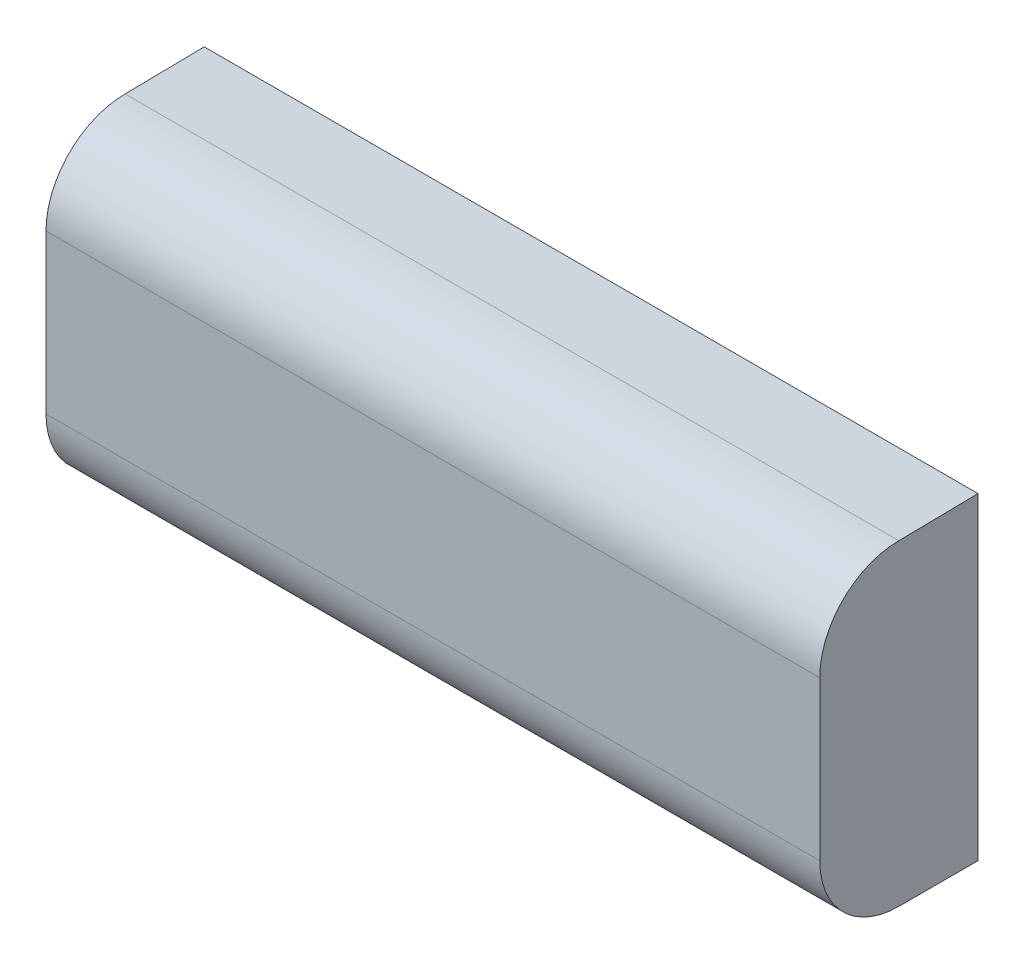
ISO-10303-21;
HEADER;
FILE_DESCRIPTION(('STEP AP214'),'2;1');
FILE_NAME('part.step','',(''),(''),'','','');
FILE_SCHEMA(('AUTOMOTIVE_DESIGN { 1 0 10303 214 1 1 1 1 }'));
ENDSEC;
DATA;
#1=APPLICATION_CONTEXT('core data for automotive mechanical design processes');
#2=APPLICATION_PROTOCOL_DEFINITION('international standard','automotive_design',2000,#1);
#3=PRODUCT_CONTEXT('',#1,'mechanical');
#4=PRODUCT('Part','Part','',(#3));
#5=PRODUCT_RELATED_PRODUCT_CATEGORY('part','',(#4));
#6=PRODUCT_DEFINITION_FORMATION('','',#4);
#7=PRODUCT_DEFINITION_CONTEXT('part definition',#1,'design');
#8=PRODUCT_DEFINITION('design','',#6,#7);
#9=PRODUCT_DEFINITION_SHAPE('','',#8);
#10=(LENGTH_UNIT() NAMED_UNIT(*) SI_UNIT(.MILLI.,.METRE.));
#11=(NAMED_UNIT(*) PLANE_ANGLE_UNIT() SI_UNIT($,.RADIAN.));
#12=(NAMED_UNIT(*) SI_UNIT($,.STERADIAN.) SOLID_ANGLE_UNIT());
#13=UNCERTAINTY_MEASURE_WITH_UNIT(LENGTH_MEASURE(1.E-05),#10,'distance_accuracy_value','');
#14=(GEOMETRIC_REPRESENTATION_CONTEXT(3) GLOBAL_UNCERTAINTY_ASSIGNED_CONTEXT((#13)) GLOBAL_UNIT_ASSIGNED_CONTEXT((#10,
#11,#12)) REPRESENTATION_CONTEXT('',''));
#15=CARTESIAN_POINT('',(0.,0.,0.));
#16=DIRECTION('',(0.,0.,1.));
#17=DIRECTION('',(1.,0.,0.));
#18=AXIS2_PLACEMENT_3D('',#15,#16,#17);
#19=CARTESIAN_POINT('',(372.58,83.2090743568865,-38.1));
#20=DIRECTION('',(0.,0.,1.));
#21=DIRECTION('',(1.,0.,0.));
#22=AXIS2_PLACEMENT_3D('',#19,#20,#21);
#23=PLANE('',#22);
#24=DIRECTION('',(0.,1.,0.));
#25=VECTOR('',#24,1.);
#26=CARTESIAN_POINT('',(0.,83.2090743568865,-38.1));
#27=LINE('',#26,#25);
#28=CARTESIAN_POINT('',(0.,-69.8859046390184,-38.1));
#29=VERTEX_POINT('',#28);
#30=CARTESIAN_POINT('',(0.,83.2090743568865,-38.1));
#31=VERTEX_POINT('',#30);
#32=EDGE_CURVE('E123',#29,#31,#27,.T.);
#33=ORIENTED_EDGE('',*,*,#32,.T.);
#34=DIRECTION('',(-1.,0.,0.));
#35=VECTOR('',#34,1.);
#36=CARTESIAN_POINT('',(372.58,83.2090743568865,-38.1));
#37=LINE('',#36,#35);
#38=CARTESIAN_POINT('',(372.58,83.2090743568865,-38.1));
#39=VERTEX_POINT('',#38);
#40=EDGE_CURVE('E11',#39,#31,#37,.T.);
#41=ORIENTED_EDGE('',*,*,#40,.F.);
#42=DIRECTION('',(0.,1.,0.));
#43=VECTOR('',#42,1.);
#44=CARTESIAN_POINT('',(372.58,83.2090743568865,-38.1));
#45=LINE('',#44,#43);
#46=CARTESIAN_POINT('',(372.58,-69.8859046390184,-38.1));
#47=VERTEX_POINT('',#46);
#48=EDGE_CURVE('E133',#47,#39,#45,.T.);
#49=ORIENTED_EDGE('',*,*,#48,.F.);
#50=DIRECTION('',(-1.,0.,0.));
#51=VECTOR('',#50,1.);
#52=CARTESIAN_POINT('',(372.58,-69.8859046390184,-38.1));
#53=LINE('',#52,#51);
#54=EDGE_CURVE('E119',#47,#29,#53,.T.);
#55=ORIENTED_EDGE('',*,*,#54,.T.);
#56=EDGE_LOOP('',(#33,#41,#49,#55));
#57=FACE_BOUND('',#56,.T.);
#58=ADVANCED_FACE('F39',(#57),#23,.F.);
#59=CARTESIAN_POINT('',(372.58,83.2090743568865,-38.1));
#60=DIRECTION('',(0.,-0.999878088718047,-0.0156143428150319));
#61=DIRECTION('',(0.,0.0156143428150319,-0.999878088718047));
#62=AXIS2_PLACEMENT_3D('',#59,#60,#61);
#63=PLANE('',#62);
#64=DIRECTION('',(0.,-0.0156143428150319,0.999878088718047));
#65=VECTOR('',#64,1.);
#66=CARTESIAN_POINT('',(0.,83.2090743568865,-38.1));
#67=LINE('',#66,#65);
#68=CARTESIAN_POINT('',(0.,82.6140953609816,0.));
#69=VERTEX_POINT('',#68);
#70=EDGE_CURVE('E126',#31,#69,#67,.T.);
#71=ORIENTED_EDGE('',*,*,#70,.T.);
#72=DIRECTION('',(-1.,0.,0.));
#73=VECTOR('',#72,1.);
#74=CARTESIAN_POINT('',(372.58,82.6140953609816,0.));
#75=LINE('',#74,#73);
#76=CARTESIAN_POINT('',(372.58,82.6140953609816,0.));
#77=VERTEX_POINT('',#76);
#78=EDGE_CURVE('E47',#77,#69,#75,.T.);
#79=ORIENTED_EDGE('',*,*,#78,.F.);
#80=DIRECTION('',(0.,-0.0156143428150319,0.999878088718047));
#81=VECTOR('',#80,1.);
#82=CARTESIAN_POINT('',(372.58,83.2090743568865,-38.1));
#83=LINE('',#82,#81);
#84=EDGE_CURVE('E92',#39,#77,#83,.T.);
#85=ORIENTED_EDGE('',*,*,#84,.F.);
#86=ORIENTED_EDGE('',*,*,#40,.T.);
#87=EDGE_LOOP('',(#71,#79,#85,#86));
#88=FACE_BOUND('',#87,.T.);
#89=ADVANCED_FACE('F157',(#88),#63,.F.);
#90=CARTESIAN_POINT('',(372.58,44.5140953609816,0.));
#91=DIRECTION('',(-1.,0.,0.));
#92=DIRECTION('',(0.,0.,1.));
#93=AXIS2_PLACEMENT_3D('',#90,#91,#92);
#94=CYLINDRICAL_SURFACE('',#93,38.1);
#95=CARTESIAN_POINT('',(0.,44.5140953609816,0.));
#96=DIRECTION('',(1.,0.,0.));
#97=DIRECTION('',(0.,0.,-1.));
#98=AXIS2_PLACEMENT_3D('',#95,#96,#97);
#99=CIRCLE('',#98,38.1);
#100=CARTESIAN_POINT('',(0.,44.5140953609816,38.1));
#101=VERTEX_POINT('',#100);
#102=EDGE_CURVE('E128',#69,#101,#99,.T.);
#103=ORIENTED_EDGE('',*,*,#102,.T.);
#104=DIRECTION('',(-1.,0.,0.));
#105=VECTOR('',#104,1.);
#106=CARTESIAN_POINT('',(372.58,44.5140953609816,38.1));
#107=LINE('',#106,#105);
#108=CARTESIAN_POINT('',(372.58,44.5140953609816,38.1));
#109=VERTEX_POINT('',#108);
#110=EDGE_CURVE('E114',#109,#101,#107,.T.);
#111=ORIENTED_EDGE('',*,*,#110,.F.);
#112=CARTESIAN_POINT('',(372.58,44.5140953609816,0.));
#113=DIRECTION('',(1.,0.,0.));
#114=DIRECTION('',(0.,0.,-1.));
#115=AXIS2_PLACEMENT_3D('',#112,#113,#114);
#116=CIRCLE('',#115,38.1);
#117=EDGE_CURVE('E105',#77,#109,#116,.T.);
#118=ORIENTED_EDGE('',*,*,#117,.F.);
#119=ORIENTED_EDGE('',*,*,#78,.T.);
#120=EDGE_LOOP('',(#103,#111,#118,#119));
#121=FACE_BOUND('',#120,.T.);
#122=ADVANCED_FACE('F139',(#121),#94,.T.);
#123=CARTESIAN_POINT('',(372.58,44.5140953609816,38.1));
#124=DIRECTION('',(0.,0.,-1.));
#125=DIRECTION('',(0.,1.,0.));
#126=AXIS2_PLACEMENT_3D('',#123,#124,#125);
#127=PLANE('',#126);
#128=DIRECTION('',(0.,-1.,0.));
#129=VECTOR('',#128,1.);
#130=CARTESIAN_POINT('',(0.,44.5140953609816,38.1));
#131=LINE('',#130,#129);
#132=CARTESIAN_POINT('',(0.,-31.7859046390184,38.1));
#133=VERTEX_POINT('',#132);
#134=EDGE_CURVE('E113',#101,#133,#131,.T.);
#135=ORIENTED_EDGE('',*,*,#134,.T.);
#136=DIRECTION('',(-1.,0.,0.));
#137=VECTOR('',#136,1.);
#138=CARTESIAN_POINT('',(372.58,-31.7859046390184,38.1));
#139=LINE('',#138,#137);
#140=CARTESIAN_POINT('',(372.58,-31.7859046390184,38.1));
#141=VERTEX_POINT('',#140);
#142=EDGE_CURVE('E110',#141,#133,#139,.T.);
#143=ORIENTED_EDGE('',*,*,#142,.F.);
#144=DIRECTION('',(0.,-1.,0.));
#145=VECTOR('',#144,1.);
#146=CARTESIAN_POINT('',(372.58,44.5140953609816,38.1));
#147=LINE('',#146,#145);
#148=EDGE_CURVE('E99',#109,#141,#147,.T.);
#149=ORIENTED_EDGE('',*,*,#148,.F.);
#150=ORIENTED_EDGE('',*,*,#110,.T.);
#151=EDGE_LOOP('',(#135,#143,#149,#150));
#152=FACE_BOUND('',#151,.T.);
#153=ADVANCED_FACE('F111',(#152),#127,.F.);
#154=CARTESIAN_POINT('',(372.58,-31.7859046390184,0.));
#155=DIRECTION('',(-1.,0.,0.));
#156=DIRECTION('',(0.,0.,1.));
#157=AXIS2_PLACEMENT_3D('',#154,#155,#156);
#158=CYLINDRICAL_SURFACE('',#157,38.1);
#159=CARTESIAN_POINT('',(0.,-31.7859046390184,0.));
#160=DIRECTION('',(1.,0.,0.));
#161=DIRECTION('',(0.,0.,-1.));
#162=AXIS2_PLACEMENT_3D('',#159,#160,#161);
#163=CIRCLE('',#162,38.1);
#164=CARTESIAN_POINT('',(0.,-69.8859046390184,0.));
#165=VERTEX_POINT('',#164);
#166=EDGE_CURVE('E78',#133,#165,#163,.T.);
#167=ORIENTED_EDGE('',*,*,#166,.T.);
#168=DIRECTION('',(-1.,0.,0.));
#169=VECTOR('',#168,1.);
#170=CARTESIAN_POINT('',(372.58,-69.8859046390184,0.));
#171=LINE('',#170,#169);
#172=CARTESIAN_POINT('',(372.58,-69.8859046390184,0.));
#173=VERTEX_POINT('',#172);
#174=EDGE_CURVE('E115',#173,#165,#171,.T.);
#175=ORIENTED_EDGE('',*,*,#174,.F.);
#176=CARTESIAN_POINT('',(372.58,-31.7859046390184,0.));
#177=DIRECTION('',(1.,0.,0.));
#178=DIRECTION('',(0.,0.,-1.));
#179=AXIS2_PLACEMENT_3D('',#176,#177,#178);
#180=CIRCLE('',#179,38.1);
#181=EDGE_CURVE('E103',#141,#173,#180,.T.);
#182=ORIENTED_EDGE('',*,*,#181,.F.);
#183=ORIENTED_EDGE('',*,*,#142,.T.);
#184=EDGE_LOOP('',(#167,#175,#182,#183));
#185=FACE_BOUND('',#184,.T.);
#186=ADVANCED_FACE('F117',(#185),#158,.T.);
#187=CARTESIAN_POINT('',(372.58,-69.8859046390184,0.));
#188=DIRECTION('',(0.,1.,0.));
#189=DIRECTION('',(0.,0.,1.));
#190=AXIS2_PLACEMENT_3D('',#187,#188,#189);
#191=PLANE('',#190);
#192=DIRECTION('',(0.,0.,-1.));
#193=VECTOR('',#192,1.);
#194=CARTESIAN_POINT('',(0.,-69.8859046390184,0.));
#195=LINE('',#194,#193);
#196=EDGE_CURVE('E84',#165,#29,#195,.T.);
#197=ORIENTED_EDGE('',*,*,#196,.T.);
#198=ORIENTED_EDGE('',*,*,#54,.F.);
#199=DIRECTION('',(0.,0.,-1.));
#200=VECTOR('',#199,1.);
#201=CARTESIAN_POINT('',(372.58,-69.8859046390184,0.));
#202=LINE('',#201,#200);
#203=EDGE_CURVE('E55',#173,#47,#202,.T.);
#204=ORIENTED_EDGE('',*,*,#203,.F.);
#205=ORIENTED_EDGE('',*,*,#174,.T.);
#206=EDGE_LOOP('',(#197,#198,#204,#205));
#207=FACE_BOUND('',#206,.T.);
#208=ADVANCED_FACE('F146',(#207),#191,.F.);
#209=CARTESIAN_POINT('',(372.58,-31.7859046390184,0.));
#210=DIRECTION('',(1.,0.,0.));
#211=DIRECTION('',(0.,0.,-1.));
#212=AXIS2_PLACEMENT_3D('',#209,#210,#211);
#213=PLANE('',#212);
#214=ORIENTED_EDGE('',*,*,#48,.T.);
#215=ORIENTED_EDGE('',*,*,#84,.T.);
#216=ORIENTED_EDGE('',*,*,#117,.T.);
#217=ORIENTED_EDGE('',*,*,#148,.T.);
#218=ORIENTED_EDGE('',*,*,#181,.T.);
#219=ORIENTED_EDGE('',*,*,#203,.T.);
#220=EDGE_LOOP('',(#214,#215,#216,#217,#218,#219));
#221=FACE_BOUND('',#220,.T.);
#222=ADVANCED_FACE('F101',(#221),#213,.T.);
#223=CARTESIAN_POINT('',(0.,-31.7859046390184,0.));
#224=DIRECTION('',(1.,0.,0.));
#225=DIRECTION('',(0.,0.,-1.));
#226=AXIS2_PLACEMENT_3D('',#223,#224,#225);
#227=PLANE('',#226);
#228=ORIENTED_EDGE('',*,*,#32,.F.);
#229=ORIENTED_EDGE('',*,*,#196,.F.);
#230=ORIENTED_EDGE('',*,*,#166,.F.);
#231=ORIENTED_EDGE('',*,*,#134,.F.);
#232=ORIENTED_EDGE('',*,*,#102,.F.);
#233=ORIENTED_EDGE('',*,*,#70,.F.);
#234=EDGE_LOOP('',(#228,#229,#230,#231,#232,#233));
#235=FACE_BOUND('',#234,.T.);
#236=ADVANCED_FACE('F142',(#235),#227,.F.);
#237=CLOSED_SHELL('',(#58,#89,#122,#153,#186,#208,#222,#236));
#238=MANIFOLD_SOLID_BREP('B2',#237);
#239=ADVANCED_BREP_SHAPE_REPRESENTATION('',(#18,#238),#14);
#240=SHAPE_DEFINITION_REPRESENTATION(#9,#239);
ENDSEC;
END-ISO-10303-21;
